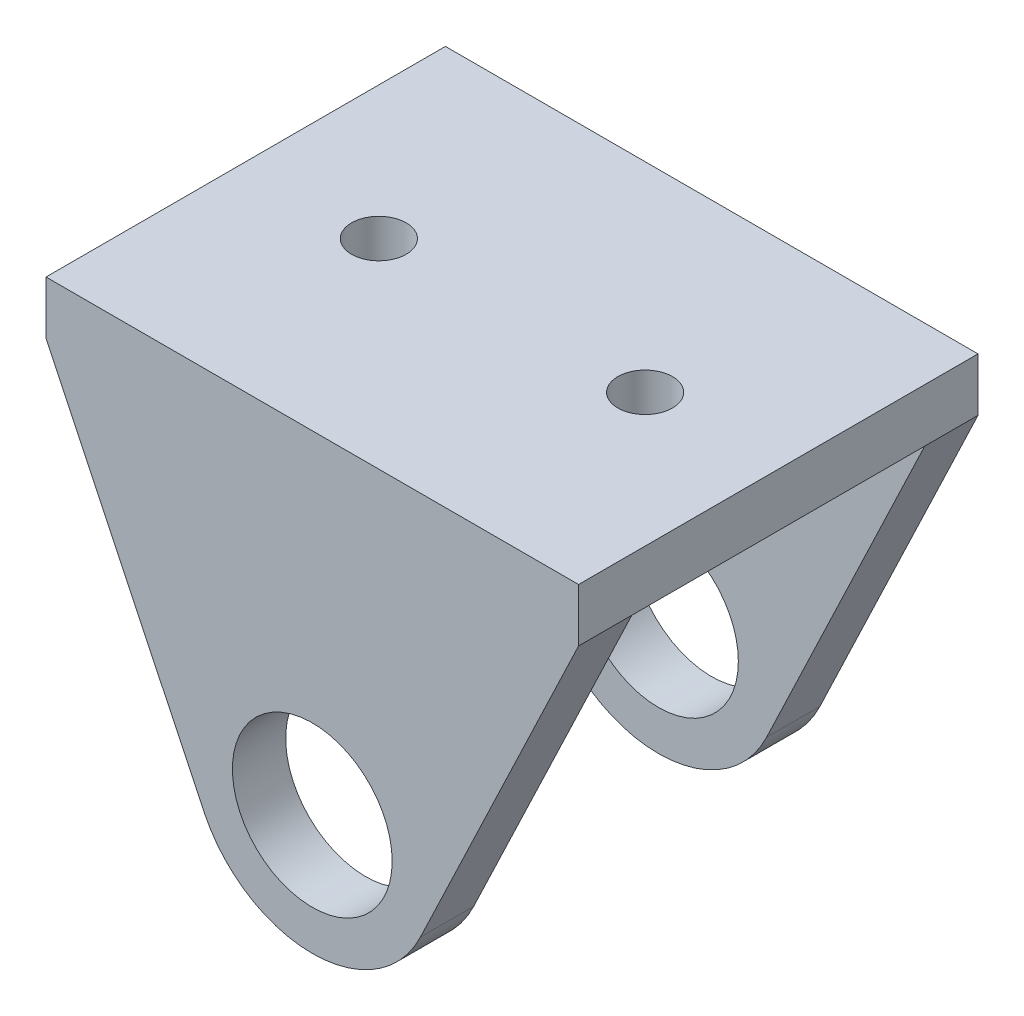
ISO-10303-21;
HEADER;
FILE_DESCRIPTION(('STEP AP214'),'2;1');
FILE_NAME('part.step','',(''),(''),'','','');
FILE_SCHEMA(('AUTOMOTIVE_DESIGN { 1 0 10303 214 1 1 1 1 }'));
ENDSEC;
DATA;
#1=APPLICATION_CONTEXT('core data for automotive mechanical design processes');
#2=APPLICATION_PROTOCOL_DEFINITION('international standard','automotive_design',2000,#1);
#3=PRODUCT_CONTEXT('',#1,'mechanical');
#4=PRODUCT('Part','Part','',(#3));
#5=PRODUCT_RELATED_PRODUCT_CATEGORY('part','',(#4));
#6=PRODUCT_DEFINITION_FORMATION('','',#4);
#7=PRODUCT_DEFINITION_CONTEXT('part definition',#1,'design');
#8=PRODUCT_DEFINITION('design','',#6,#7);
#9=PRODUCT_DEFINITION_SHAPE('','',#8);
#10=(LENGTH_UNIT() NAMED_UNIT(*) SI_UNIT(.MILLI.,.METRE.));
#11=(NAMED_UNIT(*) PLANE_ANGLE_UNIT() SI_UNIT($,.RADIAN.));
#12=(NAMED_UNIT(*) SI_UNIT($,.STERADIAN.) SOLID_ANGLE_UNIT());
#13=UNCERTAINTY_MEASURE_WITH_UNIT(LENGTH_MEASURE(1.E-05),#10,'distance_accuracy_value','');
#14=(GEOMETRIC_REPRESENTATION_CONTEXT(3) GLOBAL_UNCERTAINTY_ASSIGNED_CONTEXT((#13)) GLOBAL_UNIT_ASSIGNED_CONTEXT((#10,
#11,#12)) REPRESENTATION_CONTEXT('',''));
#15=CARTESIAN_POINT('',(0.,0.,0.));
#16=DIRECTION('',(0.,0.,1.));
#17=DIRECTION('',(1.,0.,0.));
#18=AXIS2_PLACEMENT_3D('',#15,#16,#17);
#19=CARTESIAN_POINT('',(20.,-4.,10.));
#20=DIRECTION('',(1.,0.,0.));
#21=DIRECTION('',(0.,0.,-1.));
#22=AXIS2_PLACEMENT_3D('',#19,#20,#21);
#23=PLANE('',#22);
#24=DIRECTION('',(0.,0.,-1.));
#25=VECTOR('',#24,1.);
#26=CARTESIAN_POINT('',(20.,0.,10.));
#27=LINE('',#26,#25);
#28=CARTESIAN_POINT('',(20.,0.,15.));
#29=VERTEX_POINT('',#28);
#30=CARTESIAN_POINT('',(20.,0.,-15.));
#31=VERTEX_POINT('',#30);
#32=EDGE_CURVE('E203',#29,#31,#27,.T.);
#33=ORIENTED_EDGE('',*,*,#32,.F.);
#34=DIRECTION('',(0.,1.,0.));
#35=VECTOR('',#34,1.);
#36=CARTESIAN_POINT('',(20.,-4.,15.));
#37=LINE('',#36,#35);
#38=CARTESIAN_POINT('',(20.,-4.,15.));
#39=VERTEX_POINT('',#38);
#40=EDGE_CURVE('E182',#39,#29,#37,.T.);
#41=ORIENTED_EDGE('',*,*,#40,.F.);
#42=DIRECTION('',(0.,0.,-1.));
#43=VECTOR('',#42,1.);
#44=CARTESIAN_POINT('',(20.,-4.,15.));
#45=LINE('',#44,#43);
#46=CARTESIAN_POINT('',(20.,-4.,11.));
#47=VERTEX_POINT('',#46);
#48=EDGE_CURVE('E130',#39,#47,#45,.T.);
#49=ORIENTED_EDGE('',*,*,#48,.T.);
#50=DIRECTION('',(0.,0.,-1.));
#51=VECTOR('',#50,1.);
#52=CARTESIAN_POINT('',(20.,-4.,10.));
#53=LINE('',#52,#51);
#54=CARTESIAN_POINT('',(20.,-4.,-11.));
#55=VERTEX_POINT('',#54);
#56=EDGE_CURVE('E55',#47,#55,#53,.T.);
#57=ORIENTED_EDGE('',*,*,#56,.T.);
#58=DIRECTION('',(0.,0.,1.));
#59=VECTOR('',#58,1.);
#60=CARTESIAN_POINT('',(20.,-4.,-15.));
#61=LINE('',#60,#59);
#62=CARTESIAN_POINT('',(20.,-4.,-15.));
#63=VERTEX_POINT('',#62);
#64=EDGE_CURVE('E127',#63,#55,#61,.T.);
#65=ORIENTED_EDGE('',*,*,#64,.F.);
#66=DIRECTION('',(0.,1.,0.));
#67=VECTOR('',#66,1.);
#68=CARTESIAN_POINT('',(20.,-4.,-15.));
#69=LINE('',#68,#67);
#70=EDGE_CURVE('E154',#63,#31,#69,.T.);
#71=ORIENTED_EDGE('',*,*,#70,.T.);
#72=EDGE_LOOP('',(#33,#41,#49,#57,#65,#71));
#73=FACE_BOUND('',#72,.T.);
#74=ADVANCED_FACE('F47',(#73),#23,.T.);
#75=CARTESIAN_POINT('',(-20.,-4.,10.));
#76=DIRECTION('',(-1.,0.,0.));
#77=DIRECTION('',(0.,0.,1.));
#78=AXIS2_PLACEMENT_3D('',#75,#76,#77);
#79=PLANE('',#78);
#80=DIRECTION('',(0.,0.,1.));
#81=VECTOR('',#80,1.);
#82=CARTESIAN_POINT('',(-20.,0.,10.));
#83=LINE('',#82,#81);
#84=CARTESIAN_POINT('',(-20.,0.,-15.));
#85=VERTEX_POINT('',#84);
#86=CARTESIAN_POINT('',(-20.,0.,15.));
#87=VERTEX_POINT('',#86);
#88=EDGE_CURVE('E131',#85,#87,#83,.T.);
#89=ORIENTED_EDGE('',*,*,#88,.F.);
#90=DIRECTION('',(0.,-1.,0.));
#91=VECTOR('',#90,1.);
#92=CARTESIAN_POINT('',(-20.,0.,-15.));
#93=LINE('',#92,#91);
#94=CARTESIAN_POINT('',(-20.,-4.,-15.));
#95=VERTEX_POINT('',#94);
#96=EDGE_CURVE('E236',#85,#95,#93,.T.);
#97=ORIENTED_EDGE('',*,*,#96,.T.);
#98=DIRECTION('',(0.,0.,1.));
#99=VECTOR('',#98,1.);
#100=CARTESIAN_POINT('',(-20.,-4.,-15.));
#101=LINE('',#100,#99);
#102=CARTESIAN_POINT('',(-20.,-4.,-11.));
#103=VERTEX_POINT('',#102);
#104=EDGE_CURVE('E153',#95,#103,#101,.T.);
#105=ORIENTED_EDGE('',*,*,#104,.T.);
#106=DIRECTION('',(0.,0.,1.));
#107=VECTOR('',#106,1.);
#108=CARTESIAN_POINT('',(-20.,-4.,10.));
#109=LINE('',#108,#107);
#110=CARTESIAN_POINT('',(-20.,-4.,11.));
#111=VERTEX_POINT('',#110);
#112=EDGE_CURVE('E11',#103,#111,#109,.T.);
#113=ORIENTED_EDGE('',*,*,#112,.T.);
#114=DIRECTION('',(0.,0.,-1.));
#115=VECTOR('',#114,1.);
#116=CARTESIAN_POINT('',(-20.,-4.,15.));
#117=LINE('',#116,#115);
#118=CARTESIAN_POINT('',(-20.,-4.,15.));
#119=VERTEX_POINT('',#118);
#120=EDGE_CURVE('E200',#119,#111,#117,.T.);
#121=ORIENTED_EDGE('',*,*,#120,.F.);
#122=DIRECTION('',(0.,-1.,0.));
#123=VECTOR('',#122,1.);
#124=CARTESIAN_POINT('',(-20.,0.,15.));
#125=LINE('',#124,#123);
#126=EDGE_CURVE('E188',#87,#119,#125,.T.);
#127=ORIENTED_EDGE('',*,*,#126,.F.);
#128=EDGE_LOOP('',(#89,#97,#105,#113,#121,#127));
#129=FACE_BOUND('',#128,.T.);
#130=ADVANCED_FACE('F266',(#129),#79,.T.);
#131=CARTESIAN_POINT('',(0.,-4.,0.));
#132=DIRECTION('',(0.,-1.,0.));
#133=DIRECTION('',(0.,0.,-1.));
#134=AXIS2_PLACEMENT_3D('',#131,#132,#133);
#135=PLANE('',#134);
#136=CARTESIAN_POINT('',(-10.,-4.,0.));
#137=DIRECTION('',(0.,-1.,0.));
#138=DIRECTION('',(0.,0.,-1.));
#139=AXIS2_PLACEMENT_3D('',#136,#137,#138);
#140=CIRCLE('',#139,2.05);
#141=CARTESIAN_POINT('',(-10.,-4.,-2.05));
#142=VERTEX_POINT('',#141);
#143=EDGE_CURVE('E213',#142,#142,#140,.T.);
#144=ORIENTED_EDGE('',*,*,#143,.F.);
#145=EDGE_LOOP('',(#144));
#146=FACE_BOUND('',#145,.T.);
#147=CARTESIAN_POINT('',(10.,-4.,0.));
#148=DIRECTION('',(0.,-1.,0.));
#149=DIRECTION('',(0.,0.,-1.));
#150=AXIS2_PLACEMENT_3D('',#147,#148,#149);
#151=CIRCLE('',#150,2.05);
#152=CARTESIAN_POINT('',(10.,-4.,-2.05));
#153=VERTEX_POINT('',#152);
#154=EDGE_CURVE('E218',#153,#153,#151,.T.);
#155=ORIENTED_EDGE('',*,*,#154,.F.);
#156=EDGE_LOOP('',(#155));
#157=FACE_BOUND('',#156,.T.);
#158=ORIENTED_EDGE('',*,*,#56,.F.);
#159=DIRECTION('',(1.,0.,0.));
#160=VECTOR('',#159,1.);
#161=CARTESIAN_POINT('',(20.,-4.,11.));
#162=LINE('',#161,#160);
#163=EDGE_CURVE('E167',#111,#47,#162,.T.);
#164=ORIENTED_EDGE('',*,*,#163,.F.);
#165=ORIENTED_EDGE('',*,*,#112,.F.);
#166=DIRECTION('',(1.,0.,0.));
#167=VECTOR('',#166,1.);
#168=CARTESIAN_POINT('',(20.,-4.,-11.));
#169=LINE('',#168,#167);
#170=EDGE_CURVE('E138',#103,#55,#169,.T.);
#171=ORIENTED_EDGE('',*,*,#170,.T.);
#172=EDGE_LOOP('',(#158,#164,#165,#171));
#173=FACE_BOUND('',#172,.T.);
#174=ADVANCED_FACE('F146',(#146,#157,#173),#135,.T.);
#175=CARTESIAN_POINT('',(0.,0.,0.));
#176=DIRECTION('',(0.,-1.,0.));
#177=DIRECTION('',(0.,0.,-1.));
#178=AXIS2_PLACEMENT_3D('',#175,#176,#177);
#179=PLANE('',#178);
#180=CARTESIAN_POINT('',(-10.,0.,0.));
#181=DIRECTION('',(0.,-1.,0.));
#182=DIRECTION('',(0.,0.,-1.));
#183=AXIS2_PLACEMENT_3D('',#180,#181,#182);
#184=CIRCLE('',#183,2.05);
#185=CARTESIAN_POINT('',(-10.,0.,-2.05));
#186=VERTEX_POINT('',#185);
#187=EDGE_CURVE('E50',#186,#186,#184,.T.);
#188=ORIENTED_EDGE('',*,*,#187,.T.);
#189=EDGE_LOOP('',(#188));
#190=FACE_BOUND('',#189,.T.);
#191=CARTESIAN_POINT('',(10.,0.,0.));
#192=DIRECTION('',(0.,-1.,0.));
#193=DIRECTION('',(0.,0.,-1.));
#194=AXIS2_PLACEMENT_3D('',#191,#192,#193);
#195=CIRCLE('',#194,2.05);
#196=CARTESIAN_POINT('',(10.,0.,-2.05));
#197=VERTEX_POINT('',#196);
#198=EDGE_CURVE('E211',#197,#197,#195,.T.);
#199=ORIENTED_EDGE('',*,*,#198,.T.);
#200=EDGE_LOOP('',(#199));
#201=FACE_BOUND('',#200,.T.);
#202=ORIENTED_EDGE('',*,*,#32,.T.);
#203=DIRECTION('',(-1.,0.,0.));
#204=VECTOR('',#203,1.);
#205=CARTESIAN_POINT('',(20.,0.,-15.));
#206=LINE('',#205,#204);
#207=EDGE_CURVE('E159',#31,#85,#206,.T.);
#208=ORIENTED_EDGE('',*,*,#207,.T.);
#209=ORIENTED_EDGE('',*,*,#88,.T.);
#210=DIRECTION('',(-1.,0.,0.));
#211=VECTOR('',#210,1.);
#212=CARTESIAN_POINT('',(20.,0.,15.));
#213=LINE('',#212,#211);
#214=EDGE_CURVE('E185',#29,#87,#213,.T.);
#215=ORIENTED_EDGE('',*,*,#214,.F.);
#216=EDGE_LOOP('',(#202,#208,#209,#215));
#217=FACE_BOUND('',#216,.T.);
#218=ADVANCED_FACE('F241',(#190,#201,#217),#179,.F.);
#219=CARTESIAN_POINT('',(0.,-25.,15.));
#220=DIRECTION('',(0.,0.,1.));
#221=DIRECTION('',(1.,0.,0.));
#222=AXIS2_PLACEMENT_3D('',#219,#220,#221);
#223=PLANE('',#222);
#224=DIRECTION('',(0.430870333036396,0.902413849688216,0.));
#225=VECTOR('',#224,1.);
#226=CARTESIAN_POINT('',(20.,-4.,15.));
#227=LINE('',#226,#225);
#228=CARTESIAN_POINT('',(8.12172464719394,-28.8778329973276,15.));
#229=VERTEX_POINT('',#228);
#230=EDGE_CURVE('E179',#229,#39,#227,.T.);
#231=ORIENTED_EDGE('',*,*,#230,.T.);
#232=ORIENTED_EDGE('',*,*,#40,.T.);
#233=ORIENTED_EDGE('',*,*,#214,.T.);
#234=ORIENTED_EDGE('',*,*,#126,.T.);
#235=DIRECTION('',(0.430870333036396,-0.902413849688216,0.));
#236=VECTOR('',#235,1.);
#237=CARTESIAN_POINT('',(-20.,-4.,15.));
#238=LINE('',#237,#236);
#239=CARTESIAN_POINT('',(-8.12172464719393,-28.8778329973276,15.));
#240=VERTEX_POINT('',#239);
#241=EDGE_CURVE('E190',#119,#240,#238,.T.);
#242=ORIENTED_EDGE('',*,*,#241,.T.);
#243=CARTESIAN_POINT('',(0.,-25.,15.));
#244=DIRECTION('',(0.,0.,1.));
#245=DIRECTION('',(1.,0.,0.));
#246=AXIS2_PLACEMENT_3D('',#243,#244,#245);
#247=CIRCLE('',#246,9.);
#248=EDGE_CURVE('E192',#240,#229,#247,.T.);
#249=ORIENTED_EDGE('',*,*,#248,.T.);
#250=EDGE_LOOP('',(#231,#232,#233,#234,#242,#249));
#251=FACE_BOUND('',#250,.T.);
#252=CARTESIAN_POINT('',(0.,-25.,15.));
#253=DIRECTION('',(0.,0.,1.));
#254=DIRECTION('',(1.,0.,0.));
#255=AXIS2_PLACEMENT_3D('',#252,#253,#254);
#256=CIRCLE('',#255,6.);
#257=CARTESIAN_POINT('',(6.,-25.,15.));
#258=VERTEX_POINT('',#257);
#259=EDGE_CURVE('E176',#258,#258,#256,.T.);
#260=ORIENTED_EDGE('',*,*,#259,.F.);
#261=EDGE_LOOP('',(#260));
#262=FACE_BOUND('',#261,.T.);
#263=ADVANCED_FACE('F248',(#251,#262),#223,.T.);
#264=CARTESIAN_POINT('',(20.,-4.,15.));
#265=DIRECTION('',(-0.902413849688216,0.430870333036396,0.));
#266=DIRECTION('',(-0.430870333036396,-0.902413849688216,0.));
#267=AXIS2_PLACEMENT_3D('',#264,#265,#266);
#268=PLANE('',#267);
#269=DIRECTION('',(0.,0.,-1.));
#270=VECTOR('',#269,1.);
#271=CARTESIAN_POINT('',(8.12172464719394,-28.8778329973276,15.));
#272=LINE('',#271,#270);
#273=CARTESIAN_POINT('',(8.12172464719394,-28.8778329973276,11.));
#274=VERTEX_POINT('',#273);
#275=EDGE_CURVE('E194',#229,#274,#272,.T.);
#276=ORIENTED_EDGE('',*,*,#275,.T.);
#277=DIRECTION('',(0.430870333036396,0.902413849688216,0.));
#278=VECTOR('',#277,1.);
#279=CARTESIAN_POINT('',(20.,-4.,11.));
#280=LINE('',#279,#278);
#281=EDGE_CURVE('E69',#274,#47,#280,.T.);
#282=ORIENTED_EDGE('',*,*,#281,.T.);
#283=ORIENTED_EDGE('',*,*,#48,.F.);
#284=ORIENTED_EDGE('',*,*,#230,.F.);
#285=EDGE_LOOP('',(#276,#282,#283,#284));
#286=FACE_BOUND('',#285,.T.);
#287=ADVANCED_FACE('F255',(#286),#268,.F.);
#288=CARTESIAN_POINT('',(-20.,-4.,15.));
#289=DIRECTION('',(0.902413849688216,0.430870333036396,0.));
#290=DIRECTION('',(-0.430870333036396,0.902413849688216,0.));
#291=AXIS2_PLACEMENT_3D('',#288,#289,#290);
#292=PLANE('',#291);
#293=ORIENTED_EDGE('',*,*,#120,.T.);
#294=DIRECTION('',(0.430870333036396,-0.902413849688216,0.));
#295=VECTOR('',#294,1.);
#296=CARTESIAN_POINT('',(-20.,-4.,11.));
#297=LINE('',#296,#295);
#298=CARTESIAN_POINT('',(-8.12172464719394,-28.8778329973276,11.));
#299=VERTEX_POINT('',#298);
#300=EDGE_CURVE('E172',#111,#299,#297,.T.);
#301=ORIENTED_EDGE('',*,*,#300,.T.);
#302=DIRECTION('',(0.,0.,-1.));
#303=VECTOR('',#302,1.);
#304=CARTESIAN_POINT('',(-8.12172464719393,-28.8778329973276,15.));
#305=LINE('',#304,#303);
#306=EDGE_CURVE('E197',#240,#299,#305,.T.);
#307=ORIENTED_EDGE('',*,*,#306,.F.);
#308=ORIENTED_EDGE('',*,*,#241,.F.);
#309=EDGE_LOOP('',(#293,#301,#307,#308));
#310=FACE_BOUND('',#309,.T.);
#311=ADVANCED_FACE('F262',(#310),#292,.F.);
#312=CARTESIAN_POINT('',(0.,-25.,15.));
#313=DIRECTION('',(0.,0.,-1.));
#314=DIRECTION('',(-1.,0.,0.));
#315=AXIS2_PLACEMENT_3D('',#312,#313,#314);
#316=CYLINDRICAL_SURFACE('',#315,9.);
#317=ORIENTED_EDGE('',*,*,#306,.T.);
#318=CARTESIAN_POINT('',(0.,-25.,11.));
#319=DIRECTION('',(0.,0.,1.));
#320=DIRECTION('',(1.,0.,0.));
#321=AXIS2_PLACEMENT_3D('',#318,#319,#320);
#322=CIRCLE('',#321,9.);
#323=EDGE_CURVE('E170',#299,#274,#322,.T.);
#324=ORIENTED_EDGE('',*,*,#323,.T.);
#325=ORIENTED_EDGE('',*,*,#275,.F.);
#326=ORIENTED_EDGE('',*,*,#248,.F.);
#327=EDGE_LOOP('',(#317,#324,#325,#326));
#328=FACE_BOUND('',#327,.T.);
#329=ADVANCED_FACE('F257',(#328),#316,.T.);
#330=CARTESIAN_POINT('',(0.,-25.,15.));
#331=DIRECTION('',(0.,0.,-1.));
#332=DIRECTION('',(-1.,0.,0.));
#333=AXIS2_PLACEMENT_3D('',#330,#331,#332);
#334=CYLINDRICAL_SURFACE('',#333,6.);
#335=CARTESIAN_POINT('',(0.,-25.,11.));
#336=DIRECTION('',(0.,0.,1.));
#337=DIRECTION('',(1.,0.,0.));
#338=AXIS2_PLACEMENT_3D('',#335,#336,#337);
#339=CIRCLE('',#338,6.);
#340=CARTESIAN_POINT('',(6.,-25.,11.));
#341=VERTEX_POINT('',#340);
#342=EDGE_CURVE('E169',#341,#341,#339,.T.);
#343=ORIENTED_EDGE('',*,*,#342,.F.);
#344=EDGE_LOOP('',(#343));
#345=FACE_BOUND('',#344,.T.);
#346=ORIENTED_EDGE('',*,*,#259,.T.);
#347=EDGE_LOOP('',(#346));
#348=FACE_BOUND('',#347,.T.);
#349=ADVANCED_FACE('F301',(#345,#348),#334,.F.);
#350=CARTESIAN_POINT('',(0.,0.,11.));
#351=DIRECTION('',(0.,0.,1.));
#352=DIRECTION('',(1.,0.,0.));
#353=AXIS2_PLACEMENT_3D('',#350,#351,#352);
#354=PLANE('',#353);
#355=ORIENTED_EDGE('',*,*,#342,.T.);
#356=EDGE_LOOP('',(#355));
#357=FACE_BOUND('',#356,.T.);
#358=ORIENTED_EDGE('',*,*,#323,.F.);
#359=ORIENTED_EDGE('',*,*,#300,.F.);
#360=ORIENTED_EDGE('',*,*,#163,.T.);
#361=ORIENTED_EDGE('',*,*,#281,.F.);
#362=EDGE_LOOP('',(#358,#359,#360,#361));
#363=FACE_BOUND('',#362,.T.);
#364=ADVANCED_FACE('F260',(#357,#363),#354,.F.);
#365=CARTESIAN_POINT('',(20.,-4.,-15.));
#366=DIRECTION('',(0.902413849688216,-0.430870333036396,0.));
#367=DIRECTION('',(0.430870333036396,0.902413849688216,0.));
#368=AXIS2_PLACEMENT_3D('',#365,#366,#367);
#369=PLANE('',#368);
#370=DIRECTION('',(0.430870333036396,0.902413849688216,0.));
#371=VECTOR('',#370,1.);
#372=CARTESIAN_POINT('',(20.,-4.,-11.));
#373=LINE('',#372,#371);
#374=CARTESIAN_POINT('',(8.12172464719394,-28.8778329973276,-11.));
#375=VERTEX_POINT('',#374);
#376=EDGE_CURVE('E135',#375,#55,#373,.T.);
#377=ORIENTED_EDGE('',*,*,#376,.F.);
#378=DIRECTION('',(0.,0.,1.));
#379=VECTOR('',#378,1.);
#380=CARTESIAN_POINT('',(8.12172464719394,-28.8778329973276,-15.));
#381=LINE('',#380,#379);
#382=CARTESIAN_POINT('',(8.12172464719394,-28.8778329973276,-15.));
#383=VERTEX_POINT('',#382);
#384=EDGE_CURVE('E165',#383,#375,#381,.T.);
#385=ORIENTED_EDGE('',*,*,#384,.F.);
#386=DIRECTION('',(0.430870333036396,0.902413849688216,0.));
#387=VECTOR('',#386,1.);
#388=CARTESIAN_POINT('',(20.,-4.,-15.));
#389=LINE('',#388,#387);
#390=EDGE_CURVE('E151',#383,#63,#389,.T.);
#391=ORIENTED_EDGE('',*,*,#390,.T.);
#392=ORIENTED_EDGE('',*,*,#64,.T.);
#393=EDGE_LOOP('',(#377,#385,#391,#392));
#394=FACE_BOUND('',#393,.T.);
#395=ADVANCED_FACE('F149',(#394),#369,.T.);
#396=CARTESIAN_POINT('',(0.,-25.,-15.));
#397=DIRECTION('',(0.,0.,1.));
#398=DIRECTION('',(1.,0.,0.));
#399=AXIS2_PLACEMENT_3D('',#396,#397,#398);
#400=CYLINDRICAL_SURFACE('',#399,9.);
#401=CARTESIAN_POINT('',(0.,-25.,-11.));
#402=DIRECTION('',(0.,0.,-1.));
#403=DIRECTION('',(-1.,0.,0.));
#404=AXIS2_PLACEMENT_3D('',#401,#402,#403);
#405=CIRCLE('',#404,9.);
#406=CARTESIAN_POINT('',(-8.12172464719394,-28.8778329973276,-11.));
#407=VERTEX_POINT('',#406);
#408=EDGE_CURVE('E141',#407,#375,#405,.F.);
#409=ORIENTED_EDGE('',*,*,#408,.F.);
#410=DIRECTION('',(0.,0.,1.));
#411=VECTOR('',#410,1.);
#412=CARTESIAN_POINT('',(-8.12172464719393,-28.8778329973276,-15.));
#413=LINE('',#412,#411);
#414=CARTESIAN_POINT('',(-8.12172464719393,-28.8778329973276,-15.));
#415=VERTEX_POINT('',#414);
#416=EDGE_CURVE('E157',#415,#407,#413,.T.);
#417=ORIENTED_EDGE('',*,*,#416,.F.);
#418=CARTESIAN_POINT('',(0.,-25.,-15.));
#419=DIRECTION('',(0.,0.,1.));
#420=DIRECTION('',(1.,0.,0.));
#421=AXIS2_PLACEMENT_3D('',#418,#419,#420);
#422=CIRCLE('',#421,9.);
#423=EDGE_CURVE('E230',#415,#383,#422,.T.);
#424=ORIENTED_EDGE('',*,*,#423,.T.);
#425=ORIENTED_EDGE('',*,*,#384,.T.);
#426=EDGE_LOOP('',(#409,#417,#424,#425));
#427=FACE_BOUND('',#426,.T.);
#428=ADVANCED_FACE('F271',(#427),#400,.T.);
#429=CARTESIAN_POINT('',(-20.,-4.,-15.));
#430=DIRECTION('',(-0.902413849688216,-0.430870333036396,0.));
#431=DIRECTION('',(0.430870333036396,-0.902413849688216,0.));
#432=AXIS2_PLACEMENT_3D('',#429,#430,#431);
#433=PLANE('',#432);
#434=DIRECTION('',(0.430870333036396,-0.902413849688216,0.));
#435=VECTOR('',#434,1.);
#436=CARTESIAN_POINT('',(-20.,-4.,-11.));
#437=LINE('',#436,#435);
#438=EDGE_CURVE('E210',#103,#407,#437,.T.);
#439=ORIENTED_EDGE('',*,*,#438,.F.);
#440=ORIENTED_EDGE('',*,*,#104,.F.);
#441=DIRECTION('',(0.430870333036396,-0.902413849688216,0.));
#442=VECTOR('',#441,1.);
#443=CARTESIAN_POINT('',(-20.,-4.,-15.));
#444=LINE('',#443,#442);
#445=EDGE_CURVE('E233',#95,#415,#444,.T.);
#446=ORIENTED_EDGE('',*,*,#445,.T.);
#447=ORIENTED_EDGE('',*,*,#416,.T.);
#448=EDGE_LOOP('',(#439,#440,#446,#447));
#449=FACE_BOUND('',#448,.T.);
#450=ADVANCED_FACE('F268',(#449),#433,.T.);
#451=CARTESIAN_POINT('',(0.,-25.,-15.));
#452=DIRECTION('',(0.,0.,-1.));
#453=DIRECTION('',(1.,0.,0.));
#454=AXIS2_PLACEMENT_3D('',#451,#452,#453);
#455=PLANE('',#454);
#456=CARTESIAN_POINT('',(0.,-25.,-15.));
#457=DIRECTION('',(0.,0.,1.));
#458=DIRECTION('',(1.,0.,0.));
#459=AXIS2_PLACEMENT_3D('',#456,#457,#458);
#460=CIRCLE('',#459,6.);
#461=CARTESIAN_POINT('',(6.,-25.,-15.));
#462=VERTEX_POINT('',#461);
#463=EDGE_CURVE('E144',#462,#462,#460,.T.);
#464=ORIENTED_EDGE('',*,*,#463,.T.);
#465=EDGE_LOOP('',(#464));
#466=FACE_BOUND('',#465,.T.);
#467=ORIENTED_EDGE('',*,*,#390,.F.);
#468=ORIENTED_EDGE('',*,*,#423,.F.);
#469=ORIENTED_EDGE('',*,*,#445,.F.);
#470=ORIENTED_EDGE('',*,*,#96,.F.);
#471=ORIENTED_EDGE('',*,*,#207,.F.);
#472=ORIENTED_EDGE('',*,*,#70,.F.);
#473=EDGE_LOOP('',(#467,#468,#469,#470,#471,#472));
#474=FACE_BOUND('',#473,.T.);
#475=ADVANCED_FACE('F245',(#466,#474),#455,.T.);
#476=CARTESIAN_POINT('',(0.,-25.,-15.));
#477=DIRECTION('',(0.,0.,1.));
#478=DIRECTION('',(1.,0.,0.));
#479=AXIS2_PLACEMENT_3D('',#476,#477,#478);
#480=CYLINDRICAL_SURFACE('',#479,6.);
#481=CARTESIAN_POINT('',(0.,-25.,-11.));
#482=DIRECTION('',(0.,0.,-1.));
#483=DIRECTION('',(-1.,0.,0.));
#484=AXIS2_PLACEMENT_3D('',#481,#482,#483);
#485=CIRCLE('',#484,6.);
#486=CARTESIAN_POINT('',(-6.,-25.,-11.));
#487=VERTEX_POINT('',#486);
#488=EDGE_CURVE('E147',#487,#487,#485,.F.);
#489=ORIENTED_EDGE('',*,*,#488,.T.);
#490=EDGE_LOOP('',(#489));
#491=FACE_BOUND('',#490,.T.);
#492=ORIENTED_EDGE('',*,*,#463,.F.);
#493=EDGE_LOOP('',(#492));
#494=FACE_BOUND('',#493,.T.);
#495=ADVANCED_FACE('F390',(#491,#494),#480,.F.);
#496=CARTESIAN_POINT('',(0.,0.,-11.));
#497=DIRECTION('',(0.,0.,-1.));
#498=DIRECTION('',(1.,0.,0.));
#499=AXIS2_PLACEMENT_3D('',#496,#497,#498);
#500=PLANE('',#499);
#501=ORIENTED_EDGE('',*,*,#376,.T.);
#502=ORIENTED_EDGE('',*,*,#170,.F.);
#503=ORIENTED_EDGE('',*,*,#438,.T.);
#504=ORIENTED_EDGE('',*,*,#408,.T.);
#505=EDGE_LOOP('',(#501,#502,#503,#504));
#506=FACE_BOUND('',#505,.T.);
#507=ORIENTED_EDGE('',*,*,#488,.F.);
#508=EDGE_LOOP('',(#507));
#509=FACE_BOUND('',#508,.T.);
#510=ADVANCED_FACE('F136',(#506,#509),#500,.F.);
#511=CARTESIAN_POINT('',(10.,6.,0.));
#512=DIRECTION('',(0.,-1.,0.));
#513=DIRECTION('',(0.,0.,-1.));
#514=AXIS2_PLACEMENT_3D('',#511,#512,#513);
#515=CYLINDRICAL_SURFACE('',#514,2.05);
#516=ORIENTED_EDGE('',*,*,#154,.T.);
#517=EDGE_LOOP('',(#516));
#518=FACE_BOUND('',#517,.T.);
#519=ORIENTED_EDGE('',*,*,#198,.F.);
#520=EDGE_LOOP('',(#519));
#521=FACE_BOUND('',#520,.T.);
#522=ADVANCED_FACE('F400',(#518,#521),#515,.F.);
#523=CARTESIAN_POINT('',(-10.,6.,0.));
#524=DIRECTION('',(0.,-1.,0.));
#525=DIRECTION('',(0.,0.,-1.));
#526=AXIS2_PLACEMENT_3D('',#523,#524,#525);
#527=CYLINDRICAL_SURFACE('',#526,2.05);
#528=ORIENTED_EDGE('',*,*,#143,.T.);
#529=EDGE_LOOP('',(#528));
#530=FACE_BOUND('',#529,.T.);
#531=ORIENTED_EDGE('',*,*,#187,.F.);
#532=EDGE_LOOP('',(#531));
#533=FACE_BOUND('',#532,.T.);
#534=ADVANCED_FACE('F409',(#530,#533),#527,.F.);
#535=CLOSED_SHELL('',(#74,#130,#174,#218,#263,#287,#311,#329,#349,#364,#395,#428,#450,#475,#495,
#510,#522,#534));
#536=MANIFOLD_SOLID_BREP('B2',#535);
#537=ADVANCED_BREP_SHAPE_REPRESENTATION('',(#18,#536),#14);
#538=SHAPE_DEFINITION_REPRESENTATION(#9,#537);
ENDSEC;
END-ISO-10303-21;
